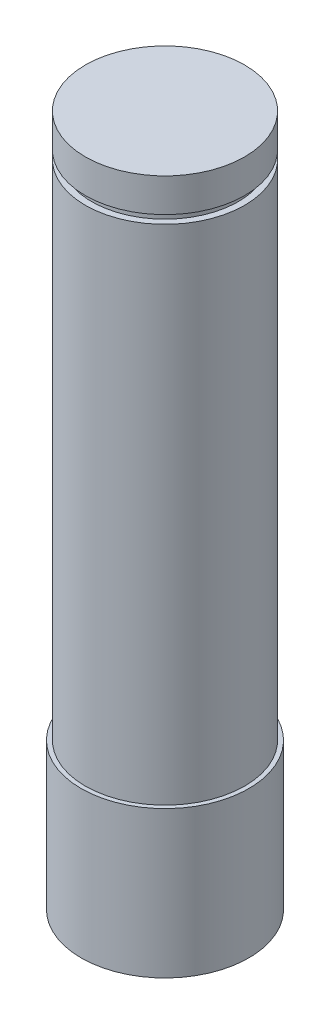
ISO-10303-21;
HEADER;
FILE_DESCRIPTION(('STEP AP214'),'2;1');
FILE_NAME('part.step','',(''),(''),'','','');
FILE_SCHEMA(('AUTOMOTIVE_DESIGN { 1 0 10303 214 1 1 1 1 }'));
ENDSEC;
DATA;
#1=APPLICATION_CONTEXT('core data for automotive mechanical design processes');
#2=APPLICATION_PROTOCOL_DEFINITION('international standard','automotive_design',2000,#1);
#3=PRODUCT_CONTEXT('',#1,'mechanical');
#4=PRODUCT('Part','Part','',(#3));
#5=PRODUCT_RELATED_PRODUCT_CATEGORY('part','',(#4));
#6=PRODUCT_DEFINITION_FORMATION('','',#4);
#7=PRODUCT_DEFINITION_CONTEXT('part definition',#1,'design');
#8=PRODUCT_DEFINITION('design','',#6,#7);
#9=PRODUCT_DEFINITION_SHAPE('','',#8);
#10=(LENGTH_UNIT() NAMED_UNIT(*) SI_UNIT(.MILLI.,.METRE.));
#11=(NAMED_UNIT(*) PLANE_ANGLE_UNIT() SI_UNIT($,.RADIAN.));
#12=(NAMED_UNIT(*) SI_UNIT($,.STERADIAN.) SOLID_ANGLE_UNIT());
#13=UNCERTAINTY_MEASURE_WITH_UNIT(LENGTH_MEASURE(1.E-05),#10,'distance_accuracy_value','');
#14=(GEOMETRIC_REPRESENTATION_CONTEXT(3) GLOBAL_UNCERTAINTY_ASSIGNED_CONTEXT((#13)) GLOBAL_UNIT_ASSIGNED_CONTEXT((#10,
#11,#12)) REPRESENTATION_CONTEXT('',''));
#15=CARTESIAN_POINT('',(0.,0.,0.));
#16=DIRECTION('',(0.,0.,1.));
#17=DIRECTION('',(1.,0.,0.));
#18=AXIS2_PLACEMENT_3D('',#15,#16,#17);
#19=CARTESIAN_POINT('',(0.,16.4999999999999,0.));
#20=DIRECTION('',(0.,-0.999999999999997,0.));
#21=DIRECTION('',(0.,0.,-1.));
#22=AXIS2_PLACEMENT_3D('',#19,#20,#21);
#23=PLANE('',#22);
#24=CARTESIAN_POINT('',(0.,16.4999999999999,0.));
#25=DIRECTION('',(0.,-0.999999999999997,0.));
#26=DIRECTION('',(0.,0.,-1.));
#27=AXIS2_PLACEMENT_3D('',#24,#25,#26);
#28=CIRCLE('',#27,1.9);
#29=CARTESIAN_POINT('',(0.,16.5,-1.9));
#30=VERTEX_POINT('',#29);
#31=EDGE_CURVE('E10',#30,#30,#28,.T.);
#32=ORIENTED_EDGE('',*,*,#31,.F.);
#33=EDGE_LOOP('',(#32));
#34=FACE_BOUND('',#33,.T.);
#35=ADVANCED_FACE('F28',(#34),#23,.F.);
#36=CARTESIAN_POINT('',(0.,0.,0.));
#37=DIRECTION('',(0.,-0.999999999999997,0.));
#38=DIRECTION('',(0.,0.,-1.));
#39=AXIS2_PLACEMENT_3D('',#36,#37,#38);
#40=CYLINDRICAL_SURFACE('',#39,1.9);
#41=CARTESIAN_POINT('',(0.,15.6999999999999,0.));
#42=DIRECTION('',(0.,-0.999999999999997,0.));
#43=DIRECTION('',(0.,0.,-1.));
#44=AXIS2_PLACEMENT_3D('',#41,#42,#43);
#45=CIRCLE('',#44,1.9);
#46=CARTESIAN_POINT('',(0.,15.6999999999999,-1.9));
#47=VERTEX_POINT('',#46);
#48=EDGE_CURVE('E34',#47,#47,#45,.T.);
#49=CARTESIAN_POINT('',(0.,15.6999999999999,-1.9));
#50=CARTESIAN_POINT('',(0.,15.7083333333333,-1.9));
#51=CARTESIAN_POINT('',(0.,15.7166666666666,-1.9));
#52=CARTESIAN_POINT('',(0.,15.7333333333333,-1.9));
#53=CARTESIAN_POINT('',(0.,15.7416666666666,-1.9));
#54=CARTESIAN_POINT('',(0.,15.7583333333333,-1.9));
#55=CARTESIAN_POINT('',(0.,15.7666666666666,-1.9));
#56=CARTESIAN_POINT('',(0.,15.7833333333333,-1.9));
#57=CARTESIAN_POINT('',(0.,15.7916666666666,-1.9));
#58=CARTESIAN_POINT('',(0.,15.8083333333333,-1.9));
#59=CARTESIAN_POINT('',(0.,15.8166666666666,-1.9));
#60=CARTESIAN_POINT('',(0.,15.8333333333333,-1.9));
#61=CARTESIAN_POINT('',(0.,15.8416666666666,-1.9));
#62=CARTESIAN_POINT('',(0.,15.8583333333333,-1.9));
#63=CARTESIAN_POINT('',(0.,15.8666666666666,-1.9));
#64=CARTESIAN_POINT('',(0.,15.8833333333333,-1.9));
#65=CARTESIAN_POINT('',(0.,15.8916666666666,-1.9));
#66=CARTESIAN_POINT('',(0.,15.9083333333333,-1.9));
#67=CARTESIAN_POINT('',(0.,15.9166666666666,-1.9));
#68=CARTESIAN_POINT('',(0.,15.9333333333333,-1.9));
#69=CARTESIAN_POINT('',(0.,15.9416666666666,-1.9));
#70=CARTESIAN_POINT('',(0.,15.9583333333333,-1.9));
#71=CARTESIAN_POINT('',(0.,15.9666666666666,-1.9));
#72=CARTESIAN_POINT('',(0.,15.9833333333333,-1.9));
#73=CARTESIAN_POINT('',(0.,15.9916666666666,-1.9));
#74=CARTESIAN_POINT('',(0.,16.0083333333333,-1.9));
#75=CARTESIAN_POINT('',(0.,16.0166666666666,-1.9));
#76=CARTESIAN_POINT('',(0.,16.0333333333333,-1.9));
#77=CARTESIAN_POINT('',(0.,16.0416666666666,-1.9));
#78=CARTESIAN_POINT('',(0.,16.0583333333333,-1.9));
#79=CARTESIAN_POINT('',(0.,16.0666666666666,-1.9));
#80=CARTESIAN_POINT('',(0.,16.0833333333333,-1.9));
#81=CARTESIAN_POINT('',(0.,16.0916666666666,-1.9));
#82=CARTESIAN_POINT('',(0.,16.1083333333333,-1.9));
#83=CARTESIAN_POINT('',(0.,16.1166666666666,-1.9));
#84=CARTESIAN_POINT('',(0.,16.1333333333333,-1.9));
#85=CARTESIAN_POINT('',(0.,16.1416666666666,-1.9));
#86=CARTESIAN_POINT('',(0.,16.1583333333333,-1.9));
#87=CARTESIAN_POINT('',(0.,16.1666666666666,-1.9));
#88=CARTESIAN_POINT('',(0.,16.1833333333333,-1.9));
#89=CARTESIAN_POINT('',(0.,16.1916666666666,-1.9));
#90=CARTESIAN_POINT('',(0.,16.2083333333333,-1.9));
#91=CARTESIAN_POINT('',(0.,16.2166666666666,-1.9));
#92=CARTESIAN_POINT('',(0.,16.2333333333333,-1.9));
#93=CARTESIAN_POINT('',(0.,16.2416666666666,-1.9));
#94=CARTESIAN_POINT('',(0.,16.2583333333333,-1.9));
#95=CARTESIAN_POINT('',(0.,16.2666666666666,-1.9));
#96=CARTESIAN_POINT('',(0.,16.2833333333333,-1.9));
#97=CARTESIAN_POINT('',(0.,16.2916666666666,-1.9));
#98=CARTESIAN_POINT('',(0.,16.3083333333333,-1.9));
#99=CARTESIAN_POINT('',(0.,16.3166666666666,-1.9));
#100=CARTESIAN_POINT('',(0.,16.3333333333333,-1.9));
#101=CARTESIAN_POINT('',(0.,16.3416666666666,-1.9));
#102=CARTESIAN_POINT('',(0.,16.3583333333333,-1.9));
#103=CARTESIAN_POINT('',(0.,16.3666666666666,-1.9));
#104=CARTESIAN_POINT('',(0.,16.3833333333333,-1.9));
#105=CARTESIAN_POINT('',(0.,16.3916666666666,-1.9));
#106=CARTESIAN_POINT('',(0.,16.4083333333333,-1.9));
#107=CARTESIAN_POINT('',(0.,16.4166666666666,-1.9));
#108=CARTESIAN_POINT('',(0.,16.4333333333333,-1.9));
#109=CARTESIAN_POINT('',(0.,16.4416666666666,-1.9));
#110=CARTESIAN_POINT('',(0.,16.4583333333333,-1.9));
#111=CARTESIAN_POINT('',(0.,16.4666666666666,-1.9));
#112=CARTESIAN_POINT('',(0.,16.4833333333333,-1.9));
#113=CARTESIAN_POINT('',(0.,16.4916666666666,-1.9));
#114=CARTESIAN_POINT('',(0.,16.5,-1.9));
#115=B_SPLINE_CURVE_WITH_KNOTS('',3,(#49,#50,#51,#52,#53,#54,#55,#56,#57,#58,#59,#60,#61,#62,
#63,#64,#65,#66,#67,#68,#69,#70,#71,#72,#73,#74,#75,#76,#77,#78,#79,#80,#81,#82,#83,#84,#85,#86,
#87,#88,#89,#90,#91,#92,#93,#94,#95,#96,#97,#98,#99,#100,#101,#102,#103,#104,#105,#106,#107,
#108,#109,#110,#111,#112,#113,#114),.UNSPECIFIED.,.F.,.F.,(4,2,2,2,2,2,2,2,2,2,2,2,2,2,2,2,2,2,
2,2,2,2,2,2,2,2,2,2,2,2,2,2,4),(0.,0.0250000000000007,0.0500000000000014,0.0749999999999987,
0.0999999999999994,0.125,0.150000000000001,0.175000000000002,0.199999999999999,0.225,0.25,
0.275000000000001,0.300000000000002,0.325000000000002,0.35,0.375,0.400000000000001,
0.425000000000002,0.450000000000003,0.475,0.499999999999997,0.524999999999998,0.549999999999998,
0.574999999999999,0.6,0.624999999999997,0.649999999999998,0.674999999999998,0.699999999999999,
0.725,0.749999999999997,0.774999999999998,0.799999999999999),.UNSPECIFIED.);
#116=EDGE_CURVE('BSEAM94',#47,#30,#115,.T.);
#117=ORIENTED_EDGE('',*,*,#48,.F.);
#118=ORIENTED_EDGE('',*,*,#31,.T.);
#119=ORIENTED_EDGE('',*,*,#116,.T.);
#120=ORIENTED_EDGE('',*,*,#116,.F.);
#121=EDGE_LOOP('',(#117,#119,#118,#120));
#122=FACE_BOUND('',#121,.T.);
#123=ADVANCED_FACE('F94',(#122),#40,.T.);
#124=CARTESIAN_POINT('',(-1.9,15.6999999999999,0.));
#125=DIRECTION('',(0.,0.999999999999997,0.));
#126=DIRECTION('',(0.,0.,1.));
#127=AXIS2_PLACEMENT_3D('',#124,#125,#126);
#128=PLANE('',#127);
#129=CARTESIAN_POINT('',(0.,15.6999999999999,0.));
#130=DIRECTION('',(0.,-0.999999999999997,0.));
#131=DIRECTION('',(0.,0.,-1.));
#132=AXIS2_PLACEMENT_3D('',#129,#130,#131);
#133=CIRCLE('',#132,1.75);
#134=CARTESIAN_POINT('',(0.,15.6999999999999,-1.75));
#135=VERTEX_POINT('',#134);
#136=EDGE_CURVE('E38',#135,#135,#133,.T.);
#137=ORIENTED_EDGE('',*,*,#136,.F.);
#138=EDGE_LOOP('',(#137));
#139=FACE_BOUND('',#138,.T.);
#140=ORIENTED_EDGE('',*,*,#48,.T.);
#141=EDGE_LOOP('',(#140));
#142=FACE_BOUND('',#141,.T.);
#143=ADVANCED_FACE('F89',(#139,#142),#128,.F.);
#144=CARTESIAN_POINT('',(0.,0.,0.));
#145=DIRECTION('',(0.,-0.999999999999997,0.));
#146=DIRECTION('',(0.,0.,-1.));
#147=AXIS2_PLACEMENT_3D('',#144,#145,#146);
#148=CYLINDRICAL_SURFACE('',#147,1.75);
#149=CARTESIAN_POINT('',(0.,15.4999999999999,0.));
#150=DIRECTION('',(0.,-0.999999999999997,0.));
#151=DIRECTION('',(0.,0.,-1.));
#152=AXIS2_PLACEMENT_3D('',#149,#150,#151);
#153=CIRCLE('',#152,1.75);
#154=CARTESIAN_POINT('',(0.,15.4999999999999,-1.75));
#155=VERTEX_POINT('',#154);
#156=EDGE_CURVE('E42',#155,#155,#153,.T.);
#157=CARTESIAN_POINT('',(0.,15.4999999999999,-1.75));
#158=CARTESIAN_POINT('',(0.,15.5020833333333,-1.75));
#159=CARTESIAN_POINT('',(0.,15.5041666666666,-1.75));
#160=CARTESIAN_POINT('',(0.,15.5083333333333,-1.75));
#161=CARTESIAN_POINT('',(0.,15.5104166666666,-1.75));
#162=CARTESIAN_POINT('',(0.,15.5145833333333,-1.75));
#163=CARTESIAN_POINT('',(0.,15.5166666666666,-1.75));
#164=CARTESIAN_POINT('',(0.,15.5208333333333,-1.75));
#165=CARTESIAN_POINT('',(0.,15.5229166666666,-1.75));
#166=CARTESIAN_POINT('',(0.,15.5270833333333,-1.75));
#167=CARTESIAN_POINT('',(0.,15.5291666666666,-1.75));
#168=CARTESIAN_POINT('',(0.,15.5333333333333,-1.75));
#169=CARTESIAN_POINT('',(0.,15.5354166666666,-1.75));
#170=CARTESIAN_POINT('',(0.,15.5395833333333,-1.75));
#171=CARTESIAN_POINT('',(0.,15.5416666666666,-1.75));
#172=CARTESIAN_POINT('',(0.,15.5458333333333,-1.75));
#173=CARTESIAN_POINT('',(0.,15.5479166666666,-1.75));
#174=CARTESIAN_POINT('',(0.,15.5520833333333,-1.75));
#175=CARTESIAN_POINT('',(0.,15.5541666666666,-1.75));
#176=CARTESIAN_POINT('',(0.,15.5583333333333,-1.75));
#177=CARTESIAN_POINT('',(0.,15.5604166666666,-1.75));
#178=CARTESIAN_POINT('',(0.,15.5645833333333,-1.75));
#179=CARTESIAN_POINT('',(0.,15.5666666666666,-1.75));
#180=CARTESIAN_POINT('',(0.,15.5708333333333,-1.75));
#181=CARTESIAN_POINT('',(0.,15.5729166666666,-1.75));
#182=CARTESIAN_POINT('',(0.,15.5770833333333,-1.75));
#183=CARTESIAN_POINT('',(0.,15.5791666666666,-1.75));
#184=CARTESIAN_POINT('',(0.,15.5833333333333,-1.75));
#185=CARTESIAN_POINT('',(0.,15.5854166666666,-1.75));
#186=CARTESIAN_POINT('',(0.,15.5895833333333,-1.75));
#187=CARTESIAN_POINT('',(0.,15.5916666666666,-1.75));
#188=CARTESIAN_POINT('',(0.,15.5958333333333,-1.75));
#189=CARTESIAN_POINT('',(0.,15.5979166666666,-1.75));
#190=CARTESIAN_POINT('',(0.,15.6020833333333,-1.75));
#191=CARTESIAN_POINT('',(0.,15.6041666666666,-1.75));
#192=CARTESIAN_POINT('',(0.,15.6083333333333,-1.75));
#193=CARTESIAN_POINT('',(0.,15.6104166666666,-1.75));
#194=CARTESIAN_POINT('',(0.,15.6145833333333,-1.75));
#195=CARTESIAN_POINT('',(0.,15.6166666666666,-1.75));
#196=CARTESIAN_POINT('',(0.,15.6208333333333,-1.75));
#197=CARTESIAN_POINT('',(0.,15.6229166666666,-1.75));
#198=CARTESIAN_POINT('',(0.,15.6270833333333,-1.75));
#199=CARTESIAN_POINT('',(0.,15.6291666666666,-1.75));
#200=CARTESIAN_POINT('',(0.,15.6333333333333,-1.75));
#201=CARTESIAN_POINT('',(0.,15.6354166666666,-1.75));
#202=CARTESIAN_POINT('',(0.,15.6395833333333,-1.75));
#203=CARTESIAN_POINT('',(0.,15.6416666666666,-1.75));
#204=CARTESIAN_POINT('',(0.,15.6458333333333,-1.75));
#205=CARTESIAN_POINT('',(0.,15.6479166666666,-1.75));
#206=CARTESIAN_POINT('',(0.,15.6520833333333,-1.75));
#207=CARTESIAN_POINT('',(0.,15.6541666666666,-1.75));
#208=CARTESIAN_POINT('',(0.,15.6583333333333,-1.75));
#209=CARTESIAN_POINT('',(0.,15.6604166666666,-1.75));
#210=CARTESIAN_POINT('',(0.,15.6645833333333,-1.75));
#211=CARTESIAN_POINT('',(0.,15.6666666666666,-1.75));
#212=CARTESIAN_POINT('',(0.,15.6708333333333,-1.75));
#213=CARTESIAN_POINT('',(0.,15.6729166666666,-1.75));
#214=CARTESIAN_POINT('',(0.,15.6770833333333,-1.75));
#215=CARTESIAN_POINT('',(0.,15.6791666666666,-1.75));
#216=CARTESIAN_POINT('',(0.,15.6833333333333,-1.75));
#217=CARTESIAN_POINT('',(0.,15.6854166666666,-1.75));
#218=CARTESIAN_POINT('',(0.,15.6895833333333,-1.75));
#219=CARTESIAN_POINT('',(0.,15.6916666666666,-1.75));
#220=CARTESIAN_POINT('',(0.,15.6958333333333,-1.75));
#221=CARTESIAN_POINT('',(0.,15.6979166666666,-1.75));
#222=CARTESIAN_POINT('',(0.,15.6999999999999,-1.75));
#223=B_SPLINE_CURVE_WITH_KNOTS('',3,(#157,#158,#159,#160,#161,#162,#163,#164,#165,#166,#167,
#168,#169,#170,#171,#172,#173,#174,#175,#176,#177,#178,#179,#180,#181,#182,#183,#184,#185,#186,
#187,#188,#189,#190,#191,#192,#193,#194,#195,#196,#197,#198,#199,#200,#201,#202,#203,#204,#205,
#206,#207,#208,#209,#210,#211,#212,#213,#214,#215,#216,#217,#218,#219,#220,#221,#222),
.UNSPECIFIED.,.F.,.F.,(4,2,2,2,2,2,2,2,2,2,2,2,2,2,2,2,2,2,2,2,2,2,2,2,2,2,2,2,2,2,2,2,4),(0.,
0.00624999999999931,0.0125000000000004,0.0187500000000014,0.0250000000000007,0.03125,
0.0375000000000011,0.0437500000000021,0.0500000000000014,0.0562500000000007,0.0625000000000018,
0.0687500000000028,0.0750000000000021,0.0812500000000015,0.0875000000000025,0.0937500000000036,
0.100000000000003,0.106250000000002,0.112500000000003,0.118750000000004,0.125000000000004,
0.131250000000003,0.137500000000006,0.143750000000005,0.150000000000004,0.156250000000004,
0.162500000000003,0.168750000000006,0.175000000000005,0.181250000000004,0.187500000000007,
0.193750000000006,0.200000000000006),.UNSPECIFIED.);
#224=EDGE_CURVE('BSEAM83',#155,#135,#223,.T.);
#225=ORIENTED_EDGE('',*,*,#156,.F.);
#226=ORIENTED_EDGE('',*,*,#136,.T.);
#227=ORIENTED_EDGE('',*,*,#224,.T.);
#228=ORIENTED_EDGE('',*,*,#224,.F.);
#229=EDGE_LOOP('',(#225,#227,#226,#228));
#230=FACE_BOUND('',#229,.T.);
#231=ADVANCED_FACE('F83',(#230),#148,.T.);
#232=CARTESIAN_POINT('',(-1.9,15.4999999999999,0.));
#233=DIRECTION('',(0.,-0.999999999999997,0.));
#234=DIRECTION('',(0.,0.,-1.));
#235=AXIS2_PLACEMENT_3D('',#232,#233,#234);
#236=PLANE('',#235);
#237=CARTESIAN_POINT('',(0.,15.4999999999999,0.));
#238=DIRECTION('',(0.,-0.999999999999997,0.));
#239=DIRECTION('',(0.,0.,-1.));
#240=AXIS2_PLACEMENT_3D('',#237,#238,#239);
#241=CIRCLE('',#240,1.9);
#242=CARTESIAN_POINT('',(0.,15.4999999999999,-1.9));
#243=VERTEX_POINT('',#242);
#244=EDGE_CURVE('E47',#243,#243,#241,.T.);
#245=ORIENTED_EDGE('',*,*,#244,.F.);
#246=EDGE_LOOP('',(#245));
#247=FACE_BOUND('',#246,.T.);
#248=ORIENTED_EDGE('',*,*,#156,.T.);
#249=EDGE_LOOP('',(#248));
#250=FACE_BOUND('',#249,.T.);
#251=ADVANCED_FACE('F77',(#247,#250),#236,.F.);
#252=CARTESIAN_POINT('',(0.,0.,0.));
#253=DIRECTION('',(0.,-0.999999999999997,0.));
#254=DIRECTION('',(0.,0.,-1.));
#255=AXIS2_PLACEMENT_3D('',#252,#253,#254);
#256=CYLINDRICAL_SURFACE('',#255,1.9);
#257=CARTESIAN_POINT('',(0.,3.5,0.));
#258=DIRECTION('',(0.,-0.999999999999997,0.));
#259=DIRECTION('',(0.,0.,-1.));
#260=AXIS2_PLACEMENT_3D('',#257,#258,#259);
#261=CIRCLE('',#260,1.9);
#262=CARTESIAN_POINT('',(0.,3.5,-1.9));
#263=VERTEX_POINT('',#262);
#264=EDGE_CURVE('E50',#263,#263,#261,.T.);
#265=CARTESIAN_POINT('',(0.,3.5,-1.9));
#266=CARTESIAN_POINT('',(0.,3.625,-1.9));
#267=CARTESIAN_POINT('',(0.,3.75,-1.9));
#268=CARTESIAN_POINT('',(0.,4.,-1.9));
#269=CARTESIAN_POINT('',(0.,4.125,-1.9));
#270=CARTESIAN_POINT('',(0.,4.375,-1.9));
#271=CARTESIAN_POINT('',(0.,4.5,-1.9));
#272=CARTESIAN_POINT('',(0.,4.75,-1.9));
#273=CARTESIAN_POINT('',(0.,4.875,-1.9));
#274=CARTESIAN_POINT('',(0.,5.125,-1.9));
#275=CARTESIAN_POINT('',(0.,5.25,-1.9));
#276=CARTESIAN_POINT('',(0.,5.49999999999999,-1.9));
#277=CARTESIAN_POINT('',(0.,5.62499999999999,-1.9));
#278=CARTESIAN_POINT('',(0.,5.87499999999999,-1.9));
#279=CARTESIAN_POINT('',(0.,5.99999999999999,-1.9));
#280=CARTESIAN_POINT('',(0.,6.24999999999999,-1.9));
#281=CARTESIAN_POINT('',(0.,6.37499999999999,-1.9));
#282=CARTESIAN_POINT('',(0.,6.62499999999999,-1.9));
#283=CARTESIAN_POINT('',(0.,6.74999999999999,-1.9));
#284=CARTESIAN_POINT('',(0.,6.99999999999999,-1.9));
#285=CARTESIAN_POINT('',(0.,7.12499999999999,-1.9));
#286=CARTESIAN_POINT('',(0.,7.37499999999998,-1.9));
#287=CARTESIAN_POINT('',(0.,7.49999999999998,-1.9));
#288=CARTESIAN_POINT('',(0.,7.74999999999998,-1.9));
#289=CARTESIAN_POINT('',(0.,7.87499999999998,-1.9));
#290=CARTESIAN_POINT('',(0.,8.12499999999998,-1.9));
#291=CARTESIAN_POINT('',(0.,8.24999999999998,-1.9));
#292=CARTESIAN_POINT('',(0.,8.49999999999998,-1.9));
#293=CARTESIAN_POINT('',(0.,8.62499999999998,-1.9));
#294=CARTESIAN_POINT('',(0.,8.87499999999998,-1.9));
#295=CARTESIAN_POINT('',(0.,8.99999999999998,-1.9));
#296=CARTESIAN_POINT('',(0.,9.24999999999998,-1.9));
#297=CARTESIAN_POINT('',(0.,9.37499999999998,-1.9));
#298=CARTESIAN_POINT('',(0.,9.62499999999997,-1.9));
#299=CARTESIAN_POINT('',(0.,9.74999999999997,-1.9));
#300=CARTESIAN_POINT('',(0.,9.99999999999997,-1.9));
#301=CARTESIAN_POINT('',(0.,10.125,-1.9));
#302=CARTESIAN_POINT('',(0.,10.375,-1.9));
#303=CARTESIAN_POINT('',(0.,10.5,-1.9));
#304=CARTESIAN_POINT('',(0.,10.75,-1.9));
#305=CARTESIAN_POINT('',(0.,10.875,-1.9));
#306=CARTESIAN_POINT('',(0.,11.125,-1.9));
#307=CARTESIAN_POINT('',(0.,11.25,-1.9));
#308=CARTESIAN_POINT('',(0.,11.5,-1.9));
#309=CARTESIAN_POINT('',(0.,11.625,-1.9));
#310=CARTESIAN_POINT('',(0.,11.875,-1.9));
#311=CARTESIAN_POINT('',(0.,12.,-1.9));
#312=CARTESIAN_POINT('',(0.,12.25,-1.9));
#313=CARTESIAN_POINT('',(0.,12.375,-1.9));
#314=CARTESIAN_POINT('',(0.,12.625,-1.9));
#315=CARTESIAN_POINT('',(0.,12.75,-1.9));
#316=CARTESIAN_POINT('',(0.,13.,-1.9));
#317=CARTESIAN_POINT('',(0.,13.125,-1.9));
#318=CARTESIAN_POINT('',(0.,13.375,-1.9));
#319=CARTESIAN_POINT('',(0.,13.5,-1.9));
#320=CARTESIAN_POINT('',(0.,13.75,-1.9));
#321=CARTESIAN_POINT('',(0.,13.875,-1.9));
#322=CARTESIAN_POINT('',(0.,14.125,-1.9));
#323=CARTESIAN_POINT('',(0.,14.25,-1.9));
#324=CARTESIAN_POINT('',(0.,14.5,-1.9));
#325=CARTESIAN_POINT('',(0.,14.625,-1.9));
#326=CARTESIAN_POINT('',(0.,14.875,-1.9));
#327=CARTESIAN_POINT('',(0.,14.9999999999999,-1.9));
#328=CARTESIAN_POINT('',(0.,15.2499999999999,-1.9));
#329=CARTESIAN_POINT('',(0.,15.3749999999999,-1.9));
#330=CARTESIAN_POINT('',(0.,15.4999999999999,-1.9));
#331=B_SPLINE_CURVE_WITH_KNOTS('',3,(#265,#266,#267,#268,#269,#270,#271,#272,#273,#274,#275,
#276,#277,#278,#279,#280,#281,#282,#283,#284,#285,#286,#287,#288,#289,#290,#291,#292,#293,#294,
#295,#296,#297,#298,#299,#300,#301,#302,#303,#304,#305,#306,#307,#308,#309,#310,#311,#312,#313,
#314,#315,#316,#317,#318,#319,#320,#321,#322,#323,#324,#325,#326,#327,#328,#329,#330),
.UNSPECIFIED.,.F.,.F.,(4,2,2,2,2,2,2,2,2,2,2,2,2,2,2,2,2,2,2,2,2,2,2,2,2,2,2,2,2,2,2,2,4),(0.,
0.374999999999998,0.749999999999997,1.12499999999999,1.49999999999999,1.87499999999999,
2.24999999999999,2.62499999999999,2.99999999999999,3.37499999999998,3.74999999999998,
4.12499999999998,4.49999999999998,4.87499999999998,5.24999999999997,5.62499999999997,
5.99999999999997,6.37499999999997,6.74999999999997,7.12499999999997,7.49999999999997,
7.87499999999996,8.24999999999996,8.62499999999996,8.99999999999996,9.37499999999995,
9.74999999999995,10.125,10.4999999999999,10.8749999999999,11.2499999999999,11.6249999999999,
11.9999999999999),.UNSPECIFIED.);
#332=EDGE_CURVE('BSEAM71',#263,#243,#331,.T.);
#333=ORIENTED_EDGE('',*,*,#264,.F.);
#334=ORIENTED_EDGE('',*,*,#244,.T.);
#335=ORIENTED_EDGE('',*,*,#332,.T.);
#336=ORIENTED_EDGE('',*,*,#332,.F.);
#337=EDGE_LOOP('',(#333,#335,#334,#336));
#338=FACE_BOUND('',#337,.T.);
#339=ADVANCED_FACE('F71',(#338),#256,.T.);
#340=CARTESIAN_POINT('',(-1.90000000000001,3.5,0.));
#341=DIRECTION('',(0.,-0.999999999999997,0.));
#342=DIRECTION('',(0.,0.,-1.));
#343=AXIS2_PLACEMENT_3D('',#340,#341,#342);
#344=PLANE('',#343);
#345=CARTESIAN_POINT('',(0.,3.5,0.));
#346=DIRECTION('',(0.,-0.999999999999997,0.));
#347=DIRECTION('',(0.,0.,-1.));
#348=AXIS2_PLACEMENT_3D('',#345,#346,#347);
#349=CIRCLE('',#348,2.);
#350=CARTESIAN_POINT('',(0.,3.5,-2.));
#351=VERTEX_POINT('',#350);
#352=EDGE_CURVE('E53',#351,#351,#349,.T.);
#353=ORIENTED_EDGE('',*,*,#352,.F.);
#354=EDGE_LOOP('',(#353));
#355=FACE_BOUND('',#354,.T.);
#356=ORIENTED_EDGE('',*,*,#264,.T.);
#357=EDGE_LOOP('',(#356));
#358=FACE_BOUND('',#357,.T.);
#359=ADVANCED_FACE('F65',(#355,#358),#344,.F.);
#360=CARTESIAN_POINT('',(0.,0.,0.));
#361=DIRECTION('',(0.,-0.999999999999997,0.));
#362=DIRECTION('',(0.,0.,-1.));
#363=AXIS2_PLACEMENT_3D('',#360,#361,#362);
#364=CYLINDRICAL_SURFACE('',#363,2.);
#365=CARTESIAN_POINT('',(0.,0.,0.));
#366=DIRECTION('',(0.,-0.999999999999997,0.));
#367=DIRECTION('',(0.,0.,-1.));
#368=AXIS2_PLACEMENT_3D('',#365,#366,#367);
#369=CIRCLE('',#368,2.);
#370=CARTESIAN_POINT('',(0.,0.,-2.));
#371=VERTEX_POINT('',#370);
#372=EDGE_CURVE('E56',#371,#371,#369,.T.);
#373=CARTESIAN_POINT('',(0.,0.,-2.));
#374=CARTESIAN_POINT('',(0.,0.0364583333333334,-2.));
#375=CARTESIAN_POINT('',(0.,0.0729166666666668,-2.));
#376=CARTESIAN_POINT('',(0.,0.145833333333333,-2.));
#377=CARTESIAN_POINT('',(0.,0.182291666666667,-2.));
#378=CARTESIAN_POINT('',(0.,0.255208333333334,-2.));
#379=CARTESIAN_POINT('',(0.,0.291666666666667,-2.));
#380=CARTESIAN_POINT('',(0.,0.364583333333334,-2.));
#381=CARTESIAN_POINT('',(0.,0.401041666666667,-2.));
#382=CARTESIAN_POINT('',(0.,0.473958333333334,-2.));
#383=CARTESIAN_POINT('',(0.,0.510416666666667,-2.));
#384=CARTESIAN_POINT('',(0.,0.583333333333334,-2.));
#385=CARTESIAN_POINT('',(0.,0.619791666666667,-2.));
#386=CARTESIAN_POINT('',(0.,0.692708333333334,-2.));
#387=CARTESIAN_POINT('',(0.,0.729166666666667,-2.));
#388=CARTESIAN_POINT('',(0.,0.802083333333334,-2.));
#389=CARTESIAN_POINT('',(0.,0.838541666666668,-2.));
#390=CARTESIAN_POINT('',(0.,0.911458333333334,-2.));
#391=CARTESIAN_POINT('',(0.,0.947916666666668,-2.));
#392=CARTESIAN_POINT('',(0.,1.02083333333333,-2.));
#393=CARTESIAN_POINT('',(0.,1.05729166666667,-2.));
#394=CARTESIAN_POINT('',(0.,1.13020833333333,-2.));
#395=CARTESIAN_POINT('',(0.,1.16666666666667,-2.));
#396=CARTESIAN_POINT('',(0.,1.23958333333333,-2.));
#397=CARTESIAN_POINT('',(0.,1.27604166666667,-2.));
#398=CARTESIAN_POINT('',(0.,1.34895833333333,-2.));
#399=CARTESIAN_POINT('',(0.,1.38541666666667,-2.));
#400=CARTESIAN_POINT('',(0.,1.45833333333333,-2.));
#401=CARTESIAN_POINT('',(0.,1.49479166666667,-2.));
#402=CARTESIAN_POINT('',(0.,1.56770833333333,-2.));
#403=CARTESIAN_POINT('',(0.,1.60416666666667,-2.));
#404=CARTESIAN_POINT('',(0.,1.67708333333333,-2.));
#405=CARTESIAN_POINT('',(0.,1.71354166666667,-2.));
#406=CARTESIAN_POINT('',(0.,1.78645833333334,-2.));
#407=CARTESIAN_POINT('',(0.,1.82291666666667,-2.));
#408=CARTESIAN_POINT('',(0.,1.89583333333334,-2.));
#409=CARTESIAN_POINT('',(0.,1.93229166666667,-2.));
#410=CARTESIAN_POINT('',(0.,2.00520833333334,-2.));
#411=CARTESIAN_POINT('',(0.,2.04166666666667,-2.));
#412=CARTESIAN_POINT('',(0.,2.11458333333334,-2.));
#413=CARTESIAN_POINT('',(0.,2.15104166666667,-2.));
#414=CARTESIAN_POINT('',(0.,2.22395833333334,-2.));
#415=CARTESIAN_POINT('',(0.,2.26041666666667,-2.));
#416=CARTESIAN_POINT('',(0.,2.33333333333334,-2.));
#417=CARTESIAN_POINT('',(0.,2.36979166666667,-2.));
#418=CARTESIAN_POINT('',(0.,2.44270833333334,-2.));
#419=CARTESIAN_POINT('',(0.,2.47916666666667,-2.));
#420=CARTESIAN_POINT('',(0.,2.55208333333334,-2.));
#421=CARTESIAN_POINT('',(0.,2.58854166666667,-2.));
#422=CARTESIAN_POINT('',(0.,2.66145833333334,-2.));
#423=CARTESIAN_POINT('',(0.,2.69791666666667,-2.));
#424=CARTESIAN_POINT('',(0.,2.77083333333334,-2.));
#425=CARTESIAN_POINT('',(0.,2.80729166666667,-2.));
#426=CARTESIAN_POINT('',(0.,2.88020833333334,-2.));
#427=CARTESIAN_POINT('',(0.,2.91666666666667,-2.));
#428=CARTESIAN_POINT('',(0.,2.98958333333334,-2.));
#429=CARTESIAN_POINT('',(0.,3.02604166666667,-2.));
#430=CARTESIAN_POINT('',(0.,3.09895833333334,-2.));
#431=CARTESIAN_POINT('',(0.,3.13541666666667,-2.));
#432=CARTESIAN_POINT('',(0.,3.20833333333334,-2.));
#433=CARTESIAN_POINT('',(0.,3.24479166666667,-2.));
#434=CARTESIAN_POINT('',(0.,3.31770833333334,-2.));
#435=CARTESIAN_POINT('',(0.,3.35416666666667,-2.));
#436=CARTESIAN_POINT('',(0.,3.42708333333334,-2.));
#437=CARTESIAN_POINT('',(0.,3.46354166666667,-2.));
#438=CARTESIAN_POINT('',(0.,3.5,-2.));
#439=B_SPLINE_CURVE_WITH_KNOTS('',3,(#373,#374,#375,#376,#377,#378,#379,#380,#381,#382,#383,
#384,#385,#386,#387,#388,#389,#390,#391,#392,#393,#394,#395,#396,#397,#398,#399,#400,#401,#402,
#403,#404,#405,#406,#407,#408,#409,#410,#411,#412,#413,#414,#415,#416,#417,#418,#419,#420,#421,
#422,#423,#424,#425,#426,#427,#428,#429,#430,#431,#432,#433,#434,#435,#436,#437,#438),
.UNSPECIFIED.,.F.,.F.,(4,2,2,2,2,2,2,2,2,2,2,2,2,2,2,2,2,2,2,2,2,2,2,2,2,2,2,2,2,2,2,2,4),(0.,
0.109375,0.21875,0.328125,0.4375,0.546875,0.656250000000001,0.765625000000001,0.875000000000001,
0.984375000000001,1.09375,1.203125,1.3125,1.421875,1.53125,1.640625,1.75,1.859375,1.96875,
2.078125,2.1875,2.296875,2.40625,2.515625,2.625,2.734375,2.84375,2.953125,3.0625,3.171875,
3.28125,3.390625,3.5),.UNSPECIFIED.);
#440=EDGE_CURVE('BSEAM62',#371,#351,#439,.T.);
#441=ORIENTED_EDGE('',*,*,#372,.F.);
#442=ORIENTED_EDGE('',*,*,#352,.T.);
#443=ORIENTED_EDGE('',*,*,#440,.T.);
#444=ORIENTED_EDGE('',*,*,#440,.F.);
#445=EDGE_LOOP('',(#441,#443,#442,#444));
#446=FACE_BOUND('',#445,.T.);
#447=ADVANCED_FACE('F62',(#446),#364,.T.);
#448=CARTESIAN_POINT('',(-2.,0.,0.));
#449=DIRECTION('',(0.,0.999999999999997,0.));
#450=DIRECTION('',(0.,0.,1.));
#451=AXIS2_PLACEMENT_3D('',#448,#449,#450);
#452=PLANE('',#451);
#453=ORIENTED_EDGE('',*,*,#372,.T.);
#454=EDGE_LOOP('',(#453));
#455=FACE_BOUND('',#454,.T.);
#456=ADVANCED_FACE('F60',(#455),#452,.F.);
#457=CLOSED_SHELL('',(#35,#123,#143,#231,#251,#339,#359,#447,#456));
#458=MANIFOLD_SOLID_BREP('B2',#457);
#459=ADVANCED_BREP_SHAPE_REPRESENTATION('',(#18,#458),#14);
#460=SHAPE_DEFINITION_REPRESENTATION(#9,#459);
ENDSEC;
END-ISO-10303-21;
